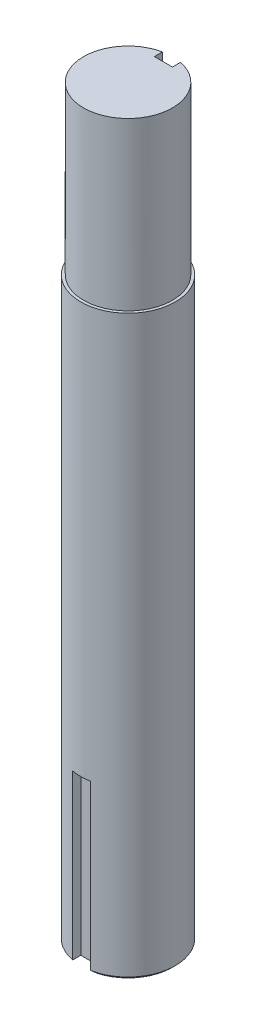
ISO-10303-21;
HEADER;
FILE_DESCRIPTION(('STEP AP214'),'2;1');
FILE_NAME('part.step','',(''),(''),'','','');
FILE_SCHEMA(('AUTOMOTIVE_DESIGN { 1 0 10303 214 1 1 1 1 }'));
ENDSEC;
DATA;
#1=APPLICATION_CONTEXT('core data for automotive mechanical design processes');
#2=APPLICATION_PROTOCOL_DEFINITION('international standard','automotive_design',2000,#1);
#3=PRODUCT_CONTEXT('',#1,'mechanical');
#4=PRODUCT('Part','Part','',(#3));
#5=PRODUCT_RELATED_PRODUCT_CATEGORY('part','',(#4));
#6=PRODUCT_DEFINITION_FORMATION('','',#4);
#7=PRODUCT_DEFINITION_CONTEXT('part definition',#1,'design');
#8=PRODUCT_DEFINITION('design','',#6,#7);
#9=PRODUCT_DEFINITION_SHAPE('','',#8);
#10=(LENGTH_UNIT() NAMED_UNIT(*) SI_UNIT(.MILLI.,.METRE.));
#11=(NAMED_UNIT(*) PLANE_ANGLE_UNIT() SI_UNIT($,.RADIAN.));
#12=(NAMED_UNIT(*) SI_UNIT($,.STERADIAN.) SOLID_ANGLE_UNIT());
#13=UNCERTAINTY_MEASURE_WITH_UNIT(LENGTH_MEASURE(1.E-05),#10,'distance_accuracy_value','');
#14=(GEOMETRIC_REPRESENTATION_CONTEXT(3) GLOBAL_UNCERTAINTY_ASSIGNED_CONTEXT((#13)) GLOBAL_UNIT_ASSIGNED_CONTEXT((#10,
#11,#12)) REPRESENTATION_CONTEXT('',''));
#15=CARTESIAN_POINT('',(0.,0.,0.));
#16=DIRECTION('',(0.,0.,1.));
#17=DIRECTION('',(1.,0.,0.));
#18=AXIS2_PLACEMENT_3D('',#15,#16,#17);
#19=CARTESIAN_POINT('',(0.,134.,0.));
#20=DIRECTION('',(0.,1.,0.));
#21=DIRECTION('',(0.,0.,1.));
#22=AXIS2_PLACEMENT_3D('',#19,#20,#21);
#23=CYLINDRICAL_SURFACE('',#22,8.49999999999999);
#24=DIRECTION('',(0.,1.,0.));
#25=VECTOR('',#24,1.);
#26=CARTESIAN_POINT('',(1.625,134.,8.34322329798261));
#27=LINE('',#26,#25);
#28=CARTESIAN_POINT('',(1.625,30.,8.34322329798261));
#29=VERTEX_POINT('',#28);
#30=CARTESIAN_POINT('',(1.625,0.500000000000028,8.34322329798261));
#31=VERTEX_POINT('',#30);
#32=EDGE_CURVE('E163',#29,#31,#27,.F.);
#33=ORIENTED_EDGE('',*,*,#32,.T.);
#34=CARTESIAN_POINT('',(0.,0.500000000000028,0.));
#35=DIRECTION('',(0.,1.,0.));
#36=DIRECTION('',(0.,0.,1.));
#37=AXIS2_PLACEMENT_3D('',#34,#35,#36);
#38=CIRCLE('',#37,8.49999999999999);
#39=CARTESIAN_POINT('',(-1.625,0.500000000000028,8.34322329798261));
#40=VERTEX_POINT('',#39);
#41=EDGE_CURVE('E169',#31,#40,#38,.T.);
#42=ORIENTED_EDGE('',*,*,#41,.T.);
#43=DIRECTION('',(0.,1.,0.));
#44=VECTOR('',#43,1.);
#45=CARTESIAN_POINT('',(-1.625,134.,8.34322329798261));
#46=LINE('',#45,#44);
#47=CARTESIAN_POINT('',(-1.625,30.,8.34322329798261));
#48=VERTEX_POINT('',#47);
#49=EDGE_CURVE('E160',#40,#48,#46,.T.);
#50=ORIENTED_EDGE('',*,*,#49,.T.);
#51=CARTESIAN_POINT('',(0.,30.,0.));
#52=DIRECTION('',(0.,-1.,0.));
#53=DIRECTION('',(1.,0.,0.));
#54=AXIS2_PLACEMENT_3D('',#51,#52,#53);
#55=CIRCLE('',#54,8.49999999999999);
#56=EDGE_CURVE('E166',#29,#48,#55,.T.);
#57=ORIENTED_EDGE('',*,*,#56,.F.);
#58=EDGE_LOOP('',(#33,#42,#50,#57));
#59=FACE_BOUND('',#58,.T.);
#60=CARTESIAN_POINT('',(0.,104.,0.));
#61=DIRECTION('',(0.,1.,0.));
#62=DIRECTION('',(-1.,0.,0.));
#63=AXIS2_PLACEMENT_3D('',#60,#61,#62);
#64=CIRCLE('',#63,8.49999999999999);
#65=CARTESIAN_POINT('',(-8.49999999999999,104.,0.));
#66=VERTEX_POINT('',#65);
#67=EDGE_CURVE('E145',#66,#66,#64,.T.);
#68=ORIENTED_EDGE('',*,*,#67,.F.);
#69=EDGE_LOOP('',(#68));
#70=FACE_BOUND('',#69,.T.);
#71=ADVANCED_FACE('F34',(#59,#70),#23,.T.);
#72=CARTESIAN_POINT('',(8.5,0.,0.));
#73=DIRECTION('',(0.,1.,0.));
#74=DIRECTION('',(0.,0.,1.));
#75=AXIS2_PLACEMENT_3D('',#72,#73,#74);
#76=PLANE('',#75);
#77=DIRECTION('',(-1.,0.,0.));
#78=VECTOR('',#77,1.);
#79=CARTESIAN_POINT('',(8.5,0.,6.37499999999997));
#80=LINE('',#79,#78);
#81=CARTESIAN_POINT('',(2.12500000000003,0.,6.37499999999997));
#82=VERTEX_POINT('',#81);
#83=CARTESIAN_POINT('',(-2.12500000000003,0.,6.37499999999997));
#84=VERTEX_POINT('',#83);
#85=EDGE_CURVE('E175',#82,#84,#80,.T.);
#86=ORIENTED_EDGE('',*,*,#85,.T.);
#87=DIRECTION('',(0.,0.,1.));
#88=VECTOR('',#87,1.);
#89=CARTESIAN_POINT('',(-2.12500000000002,0.,0.));
#90=LINE('',#89,#88);
#91=CARTESIAN_POINT('',(-2.12500000000002,0.,7.71261142545113));
#92=VERTEX_POINT('',#91);
#93=EDGE_CURVE('E177',#84,#92,#90,.T.);
#94=ORIENTED_EDGE('',*,*,#93,.T.);
#95=CARTESIAN_POINT('',(0.,0.,0.));
#96=DIRECTION('',(0.,1.,0.));
#97=DIRECTION('',(0.,0.,1.));
#98=AXIS2_PLACEMENT_3D('',#95,#96,#97);
#99=CIRCLE('',#98,7.99999999999996);
#100=CARTESIAN_POINT('',(2.12500000000002,0.,7.71261142545113));
#101=VERTEX_POINT('',#100);
#102=EDGE_CURVE('E171',#92,#101,#99,.F.);
#103=ORIENTED_EDGE('',*,*,#102,.T.);
#104=DIRECTION('',(0.,0.,-1.));
#105=VECTOR('',#104,1.);
#106=CARTESIAN_POINT('',(2.12500000000003,0.,0.));
#107=LINE('',#106,#105);
#108=EDGE_CURVE('E173',#101,#82,#107,.T.);
#109=ORIENTED_EDGE('',*,*,#108,.T.);
#110=EDGE_LOOP('',(#86,#94,#103,#109));
#111=FACE_BOUND('',#110,.T.);
#112=ADVANCED_FACE('F237',(#111),#76,.F.);
#113=CARTESIAN_POINT('',(0.,30.,0.));
#114=DIRECTION('',(0.,-1.,0.));
#115=DIRECTION('',(1.,0.,0.));
#116=AXIS2_PLACEMENT_3D('',#113,#114,#115);
#117=PLANE('',#116);
#118=ORIENTED_EDGE('',*,*,#56,.T.);
#119=DIRECTION('',(0.,0.,-1.));
#120=VECTOR('',#119,1.);
#121=CARTESIAN_POINT('',(-1.625,30.,10.125));
#122=LINE('',#121,#120);
#123=CARTESIAN_POINT('',(-1.625,30.,6.875));
#124=VERTEX_POINT('',#123);
#125=EDGE_CURVE('E151',#48,#124,#122,.T.);
#126=ORIENTED_EDGE('',*,*,#125,.T.);
#127=DIRECTION('',(1.,0.,0.));
#128=VECTOR('',#127,1.);
#129=CARTESIAN_POINT('',(-1.625,30.,6.875));
#130=LINE('',#129,#128);
#131=CARTESIAN_POINT('',(1.625,30.,6.875));
#132=VERTEX_POINT('',#131);
#133=EDGE_CURVE('E154',#124,#132,#130,.T.);
#134=ORIENTED_EDGE('',*,*,#133,.T.);
#135=DIRECTION('',(0.,0.,1.));
#136=VECTOR('',#135,1.);
#137=CARTESIAN_POINT('',(1.625,30.,10.125));
#138=LINE('',#137,#136);
#139=EDGE_CURVE('E148',#132,#29,#138,.T.);
#140=ORIENTED_EDGE('',*,*,#139,.T.);
#141=EDGE_LOOP('',(#118,#126,#134,#140));
#142=FACE_BOUND('',#141,.T.);
#143=ADVANCED_FACE('F243',(#142),#117,.T.);
#144=CARTESIAN_POINT('',(1.625,30.,10.125));
#145=DIRECTION('',(1.,0.,0.));
#146=DIRECTION('',(0.,0.,-1.));
#147=AXIS2_PLACEMENT_3D('',#144,#145,#146);
#148=PLANE('',#147);
#149=DIRECTION('',(0.,-1.,0.));
#150=VECTOR('',#149,1.);
#151=CARTESIAN_POINT('',(1.625,30.,6.875));
#152=LINE('',#151,#150);
#153=CARTESIAN_POINT('',(1.625,0.500000000000025,6.875));
#154=VERTEX_POINT('',#153);
#155=EDGE_CURVE('E158',#132,#154,#152,.T.);
#156=ORIENTED_EDGE('',*,*,#155,.T.);
#157=DIRECTION('',(0.,0.,1.));
#158=VECTOR('',#157,1.);
#159=CARTESIAN_POINT('',(1.625,0.500000000000025,10.125));
#160=LINE('',#159,#158);
#161=EDGE_CURVE('E184',#154,#31,#160,.T.);
#162=ORIENTED_EDGE('',*,*,#161,.T.);
#163=ORIENTED_EDGE('',*,*,#32,.F.);
#164=ORIENTED_EDGE('',*,*,#139,.F.);
#165=EDGE_LOOP('',(#156,#162,#163,#164));
#166=FACE_BOUND('',#165,.T.);
#167=ADVANCED_FACE('F248',(#166),#148,.F.);
#168=CARTESIAN_POINT('',(-1.625,30.,10.125));
#169=DIRECTION('',(-1.,0.,0.));
#170=DIRECTION('',(0.,0.,1.));
#171=AXIS2_PLACEMENT_3D('',#168,#169,#170);
#172=PLANE('',#171);
#173=ORIENTED_EDGE('',*,*,#49,.F.);
#174=DIRECTION('',(0.,0.,-1.));
#175=VECTOR('',#174,1.);
#176=CARTESIAN_POINT('',(-1.625,0.500000000000025,10.125));
#177=LINE('',#176,#175);
#178=CARTESIAN_POINT('',(-1.625,0.500000000000025,6.875));
#179=VERTEX_POINT('',#178);
#180=EDGE_CURVE('E180',#40,#179,#177,.T.);
#181=ORIENTED_EDGE('',*,*,#180,.T.);
#182=DIRECTION('',(0.,-1.,0.));
#183=VECTOR('',#182,1.);
#184=CARTESIAN_POINT('',(-1.625,30.,6.875));
#185=LINE('',#184,#183);
#186=EDGE_CURVE('E157',#124,#179,#185,.T.);
#187=ORIENTED_EDGE('',*,*,#186,.F.);
#188=ORIENTED_EDGE('',*,*,#125,.F.);
#189=EDGE_LOOP('',(#173,#181,#187,#188));
#190=FACE_BOUND('',#189,.T.);
#191=ADVANCED_FACE('F251',(#190),#172,.F.);
#192=CARTESIAN_POINT('',(-1.625,30.,6.875));
#193=DIRECTION('',(0.,0.,-1.));
#194=DIRECTION('',(-1.,0.,0.));
#195=AXIS2_PLACEMENT_3D('',#192,#193,#194);
#196=PLANE('',#195);
#197=ORIENTED_EDGE('',*,*,#186,.T.);
#198=DIRECTION('',(1.,0.,0.));
#199=VECTOR('',#198,1.);
#200=CARTESIAN_POINT('',(-1.625,0.500000000000025,6.875));
#201=LINE('',#200,#199);
#202=EDGE_CURVE('E57',#179,#154,#201,.T.);
#203=ORIENTED_EDGE('',*,*,#202,.T.);
#204=ORIENTED_EDGE('',*,*,#155,.F.);
#205=ORIENTED_EDGE('',*,*,#133,.F.);
#206=EDGE_LOOP('',(#197,#203,#204,#205));
#207=FACE_BOUND('',#206,.T.);
#208=ADVANCED_FACE('F206',(#207),#196,.F.);
#209=CARTESIAN_POINT('',(1.625,0.500000000000025,10.125));
#210=DIRECTION('',(0.707106781186547,0.707106781186549,0.));
#211=DIRECTION('',(0.,0.,1.));
#212=AXIS2_PLACEMENT_3D('',#209,#210,#211);
#213=PLANE('',#212);
#214=CARTESIAN_POINT('',(1.625,0.500000000000026,8.34322329798261));
#215=CARTESIAN_POINT('',(1.66737279171778,0.457627208282244,8.29180115909303));
#216=CARTESIAN_POINT('',(1.70957973578112,0.415420264218903,8.24010533651233));
#217=CARTESIAN_POINT('',(1.79364274719649,0.331357252803539,8.13615765110938));
#218=CARTESIAN_POINT('',(1.83549884754812,0.289501152451909,8.08390584165546));
#219=CARTESIAN_POINT('',(1.91884936388387,0.206150636116151,7.97882734535243));
#220=CARTESIAN_POINT('',(1.96034377721472,0.164656222785309,7.92600065429245));
#221=CARTESIAN_POINT('',(2.04295800699789,0.0820419930021379,7.81975362232698));
#222=CARTESIAN_POINT('',(2.08407778743171,0.0409222125683149,7.76633322541406));
#223=CARTESIAN_POINT('',(2.12500000000002,0.,7.71261142545114));
#224=B_SPLINE_CURVE_WITH_KNOTS('',3,(#214,#215,#216,#217,#218,#219,#220,#221,#222,#223),
.UNSPECIFIED.,.F.,.F.,(4,2,2,2,4),(0.,0.23688828637859,0.473754035732428,0.71062152123972,
0.947511544651975),.UNSPECIFIED.);
#225=EDGE_CURVE('E208',#31,#101,#224,.T.);
#226=ORIENTED_EDGE('',*,*,#225,.F.);
#227=ORIENTED_EDGE('',*,*,#161,.F.);
#228=DIRECTION('',(0.577350269189627,-0.577350269189625,-0.577350269189626));
#229=VECTOR('',#228,1.);
#230=CARTESIAN_POINT('',(0.541666666666665,1.58333333333336,7.95833333333333));
#231=LINE('',#230,#229);
#232=EDGE_CURVE('E152',#82,#154,#231,.F.);
#233=ORIENTED_EDGE('',*,*,#232,.F.);
#234=ORIENTED_EDGE('',*,*,#108,.F.);
#235=EDGE_LOOP('',(#226,#227,#233,#234));
#236=FACE_BOUND('',#235,.T.);
#237=ADVANCED_FACE('F203',(#236),#213,.F.);
#238=CARTESIAN_POINT('',(-1.625,0.500000000000025,6.875));
#239=DIRECTION('',(0.,0.707106781186548,-0.707106781186547));
#240=DIRECTION('',(1.,0.,0.));
#241=AXIS2_PLACEMENT_3D('',#238,#239,#240);
#242=PLANE('',#241);
#243=ORIENTED_EDGE('',*,*,#232,.T.);
#244=ORIENTED_EDGE('',*,*,#202,.F.);
#245=DIRECTION('',(-0.577350269189626,-0.577350269189625,-0.577350269189626));
#246=VECTOR('',#245,1.);
#247=CARTESIAN_POINT('',(-4.25000000000002,-2.12499999999999,4.24999999999998));
#248=LINE('',#247,#246);
#249=EDGE_CURVE('E193',#84,#179,#248,.F.);
#250=ORIENTED_EDGE('',*,*,#249,.F.);
#251=ORIENTED_EDGE('',*,*,#85,.F.);
#252=EDGE_LOOP('',(#243,#244,#250,#251));
#253=FACE_BOUND('',#252,.T.);
#254=ADVANCED_FACE('F36',(#253),#242,.F.);
#255=CARTESIAN_POINT('',(0.,0.500000000000028,0.));
#256=DIRECTION('',(0.,1.,0.));
#257=DIRECTION('',(0.,0.,1.));
#258=AXIS2_PLACEMENT_3D('',#255,#256,#257);
#259=CONICAL_SURFACE('',#258,8.49999999999999,0.785398163397448);
#260=ORIENTED_EDGE('',*,*,#225,.T.);
#261=ORIENTED_EDGE('',*,*,#102,.F.);
#262=CARTESIAN_POINT('',(-2.12500000000003,0.,7.71261142545116));
#263=CARTESIAN_POINT('',(-2.08407778743171,0.0409222125683114,7.76633322541406));
#264=CARTESIAN_POINT('',(-2.04295800699789,0.0820419930021365,7.81975362232698));
#265=CARTESIAN_POINT('',(-1.96034377721472,0.164656222785309,7.92600065429245));
#266=CARTESIAN_POINT('',(-1.91884936388387,0.206150636116151,7.97882734535242));
#267=CARTESIAN_POINT('',(-1.83549884754812,0.289501152451908,8.08390584165546));
#268=CARTESIAN_POINT('',(-1.79364274719649,0.331357252803538,8.13615765110938));
#269=CARTESIAN_POINT('',(-1.70957973578112,0.415420264218901,8.24010533651234));
#270=CARTESIAN_POINT('',(-1.66737279171778,0.45762720828224,8.29180115909303));
#271=CARTESIAN_POINT('',(-1.62500000000001,0.500000000000018,8.34322329798262));
#272=B_SPLINE_CURVE_WITH_KNOTS('',3,(#262,#263,#264,#265,#266,#267,#268,#269,#270,#271),
.UNSPECIFIED.,.F.,.F.,(4,2,2,2,4),(0.,0.236890023412253,0.473757508919543,0.710623258273383,
0.94751154465197),.UNSPECIFIED.);
#273=EDGE_CURVE('E186',#40,#92,#272,.F.);
#274=ORIENTED_EDGE('',*,*,#273,.F.);
#275=ORIENTED_EDGE('',*,*,#41,.F.);
#276=EDGE_LOOP('',(#260,#261,#274,#275));
#277=FACE_BOUND('',#276,.T.);
#278=ADVANCED_FACE('F195',(#277),#259,.T.);
#279=CARTESIAN_POINT('',(-2.12500000000002,0.,0.));
#280=DIRECTION('',(-0.707106781186547,0.707106781186548,0.));
#281=DIRECTION('',(0.,0.,1.));
#282=AXIS2_PLACEMENT_3D('',#279,#280,#281);
#283=PLANE('',#282);
#284=ORIENTED_EDGE('',*,*,#249,.T.);
#285=ORIENTED_EDGE('',*,*,#180,.F.);
#286=ORIENTED_EDGE('',*,*,#273,.T.);
#287=ORIENTED_EDGE('',*,*,#93,.F.);
#288=EDGE_LOOP('',(#284,#285,#286,#287));
#289=FACE_BOUND('',#288,.T.);
#290=ADVANCED_FACE('F198',(#289),#283,.F.);
#291=CARTESIAN_POINT('',(0.,104.,0.));
#292=DIRECTION('',(0.,1.,0.));
#293=DIRECTION('',(-1.,0.,0.));
#294=AXIS2_PLACEMENT_3D('',#291,#292,#293);
#295=PLANE('',#294);
#296=CARTESIAN_POINT('',(0.,104.,0.));
#297=DIRECTION('',(0.,1.,0.));
#298=DIRECTION('',(-1.,0.,0.));
#299=AXIS2_PLACEMENT_3D('',#296,#297,#298);
#300=CIRCLE('',#299,8.);
#301=CARTESIAN_POINT('',(-8.,104.,0.));
#302=VERTEX_POINT('',#301);
#303=EDGE_CURVE('E142',#302,#302,#300,.T.);
#304=ORIENTED_EDGE('',*,*,#303,.F.);
#305=EDGE_LOOP('',(#304));
#306=FACE_BOUND('',#305,.T.);
#307=ORIENTED_EDGE('',*,*,#67,.T.);
#308=EDGE_LOOP('',(#307));
#309=FACE_BOUND('',#308,.T.);
#310=ADVANCED_FACE('F201',(#306,#309),#295,.T.);
#311=CARTESIAN_POINT('',(0.,104.,0.));
#312=DIRECTION('',(0.,1.,0.));
#313=DIRECTION('',(-1.,0.,0.));
#314=AXIS2_PLACEMENT_3D('',#311,#312,#313);
#315=CYLINDRICAL_SURFACE('',#314,8.);
#316=DIRECTION('',(0.,1.,0.));
#317=VECTOR('',#316,1.);
#318=CARTESIAN_POINT('',(1.625,104.,-7.83322251694665));
#319=LINE('',#318,#317);
#320=CARTESIAN_POINT('',(1.625,134.,-7.83322251694665));
#321=VERTEX_POINT('',#320);
#322=CARTESIAN_POINT('',(1.625,109.,-7.83322251694665));
#323=VERTEX_POINT('',#322);
#324=EDGE_CURVE('E139',#321,#323,#319,.F.);
#325=ORIENTED_EDGE('',*,*,#324,.F.);
#326=CARTESIAN_POINT('',(0.,134.,0.));
#327=DIRECTION('',(0.,1.,0.));
#328=DIRECTION('',(-1.,0.,0.));
#329=AXIS2_PLACEMENT_3D('',#326,#327,#328);
#330=CIRCLE('',#329,8.);
#331=CARTESIAN_POINT('',(-1.625,134.,-7.83322251694665));
#332=VERTEX_POINT('',#331);
#333=EDGE_CURVE('E141',#332,#321,#330,.T.);
#334=ORIENTED_EDGE('',*,*,#333,.F.);
#335=DIRECTION('',(0.,1.,0.));
#336=VECTOR('',#335,1.);
#337=CARTESIAN_POINT('',(-1.625,104.,-7.83322251694665));
#338=LINE('',#337,#336);
#339=CARTESIAN_POINT('',(-1.625,109.,-7.83322251694665));
#340=VERTEX_POINT('',#339);
#341=EDGE_CURVE('E49',#340,#332,#338,.T.);
#342=ORIENTED_EDGE('',*,*,#341,.F.);
#343=CARTESIAN_POINT('',(0.,109.,0.));
#344=DIRECTION('',(0.,1.,0.));
#345=DIRECTION('',(0.,0.,1.));
#346=AXIS2_PLACEMENT_3D('',#343,#344,#345);
#347=CIRCLE('',#346,8.);
#348=EDGE_CURVE('E12',#340,#323,#347,.F.);
#349=ORIENTED_EDGE('',*,*,#348,.T.);
#350=EDGE_LOOP('',(#325,#334,#342,#349));
#351=FACE_BOUND('',#350,.T.);
#352=ORIENTED_EDGE('',*,*,#303,.T.);
#353=EDGE_LOOP('',(#352));
#354=FACE_BOUND('',#353,.T.);
#355=ADVANCED_FACE('F223',(#351,#354),#315,.T.);
#356=CARTESIAN_POINT('',(8.49999999999999,134.,0.));
#357=DIRECTION('',(0.,-1.,0.));
#358=DIRECTION('',(0.,0.,-1.));
#359=AXIS2_PLACEMENT_3D('',#356,#357,#358);
#360=PLANE('',#359);
#361=ORIENTED_EDGE('',*,*,#333,.T.);
#362=DIRECTION('',(0.,0.,-1.));
#363=VECTOR('',#362,1.);
#364=CARTESIAN_POINT('',(1.625,134.,-9.625));
#365=LINE('',#364,#363);
#366=CARTESIAN_POINT('',(1.625,134.,-6.375));
#367=VERTEX_POINT('',#366);
#368=EDGE_CURVE('E133',#367,#321,#365,.T.);
#369=ORIENTED_EDGE('',*,*,#368,.F.);
#370=DIRECTION('',(1.,0.,0.));
#371=VECTOR('',#370,1.);
#372=CARTESIAN_POINT('',(-1.625,134.,-6.375));
#373=LINE('',#372,#371);
#374=CARTESIAN_POINT('',(-1.625,134.,-6.375));
#375=VERTEX_POINT('',#374);
#376=EDGE_CURVE('E135',#375,#367,#373,.T.);
#377=ORIENTED_EDGE('',*,*,#376,.F.);
#378=DIRECTION('',(0.,0.,-1.));
#379=VECTOR('',#378,1.);
#380=CARTESIAN_POINT('',(-1.625,134.,0.));
#381=LINE('',#380,#379);
#382=EDGE_CURVE('E42',#375,#332,#381,.T.);
#383=ORIENTED_EDGE('',*,*,#382,.T.);
#384=EDGE_LOOP('',(#361,#369,#377,#383));
#385=FACE_BOUND('',#384,.T.);
#386=ADVANCED_FACE('F219',(#385),#360,.F.);
#387=CARTESIAN_POINT('',(1.625,109.,-9.625));
#388=DIRECTION('',(1.,0.,0.));
#389=DIRECTION('',(0.,0.,-1.));
#390=AXIS2_PLACEMENT_3D('',#387,#388,#389);
#391=PLANE('',#390);
#392=ORIENTED_EDGE('',*,*,#324,.T.);
#393=DIRECTION('',(0.,0.,-1.));
#394=VECTOR('',#393,1.);
#395=CARTESIAN_POINT('',(1.625,109.,-9.625));
#396=LINE('',#395,#394);
#397=CARTESIAN_POINT('',(1.625,109.,-6.375));
#398=VERTEX_POINT('',#397);
#399=EDGE_CURVE('E118',#398,#323,#396,.T.);
#400=ORIENTED_EDGE('',*,*,#399,.F.);
#401=DIRECTION('',(0.,1.,0.));
#402=VECTOR('',#401,1.);
#403=CARTESIAN_POINT('',(1.625,109.,-6.375));
#404=LINE('',#403,#402);
#405=EDGE_CURVE('E126',#398,#367,#404,.T.);
#406=ORIENTED_EDGE('',*,*,#405,.T.);
#407=ORIENTED_EDGE('',*,*,#368,.T.);
#408=EDGE_LOOP('',(#392,#400,#406,#407));
#409=FACE_BOUND('',#408,.T.);
#410=ADVANCED_FACE('F226',(#409),#391,.F.);
#411=CARTESIAN_POINT('',(-1.625,109.,-6.375));
#412=DIRECTION('',(0.,0.,1.));
#413=DIRECTION('',(1.,0.,0.));
#414=AXIS2_PLACEMENT_3D('',#411,#412,#413);
#415=PLANE('',#414);
#416=ORIENTED_EDGE('',*,*,#376,.T.);
#417=ORIENTED_EDGE('',*,*,#405,.F.);
#418=DIRECTION('',(1.,0.,0.));
#419=VECTOR('',#418,1.);
#420=CARTESIAN_POINT('',(-1.625,109.,-6.375));
#421=LINE('',#420,#419);
#422=CARTESIAN_POINT('',(-1.625,109.,-6.375));
#423=VERTEX_POINT('',#422);
#424=EDGE_CURVE('E117',#423,#398,#421,.T.);
#425=ORIENTED_EDGE('',*,*,#424,.F.);
#426=DIRECTION('',(0.,1.,0.));
#427=VECTOR('',#426,1.);
#428=CARTESIAN_POINT('',(-1.625,109.,-6.375));
#429=LINE('',#428,#427);
#430=EDGE_CURVE('E121',#423,#375,#429,.T.);
#431=ORIENTED_EDGE('',*,*,#430,.T.);
#432=EDGE_LOOP('',(#416,#417,#425,#431));
#433=FACE_BOUND('',#432,.T.);
#434=ADVANCED_FACE('F128',(#433),#415,.F.);
#435=CARTESIAN_POINT('',(-1.625,109.,-9.625));
#436=DIRECTION('',(-1.,0.,0.));
#437=DIRECTION('',(0.,0.,1.));
#438=AXIS2_PLACEMENT_3D('',#435,#436,#437);
#439=PLANE('',#438);
#440=ORIENTED_EDGE('',*,*,#341,.T.);
#441=ORIENTED_EDGE('',*,*,#382,.F.);
#442=ORIENTED_EDGE('',*,*,#430,.F.);
#443=DIRECTION('',(0.,0.,1.));
#444=VECTOR('',#443,1.);
#445=CARTESIAN_POINT('',(-1.625,109.,-9.625));
#446=LINE('',#445,#444);
#447=EDGE_CURVE('E112',#340,#423,#446,.T.);
#448=ORIENTED_EDGE('',*,*,#447,.F.);
#449=EDGE_LOOP('',(#440,#441,#442,#448));
#450=FACE_BOUND('',#449,.T.);
#451=ADVANCED_FACE('F122',(#450),#439,.F.);
#452=CARTESIAN_POINT('',(0.,109.,0.));
#453=DIRECTION('',(0.,1.,0.));
#454=DIRECTION('',(0.,0.,1.));
#455=AXIS2_PLACEMENT_3D('',#452,#453,#454);
#456=PLANE('',#455);
#457=ORIENTED_EDGE('',*,*,#447,.T.);
#458=ORIENTED_EDGE('',*,*,#424,.T.);
#459=ORIENTED_EDGE('',*,*,#399,.T.);
#460=ORIENTED_EDGE('',*,*,#348,.F.);
#461=EDGE_LOOP('',(#457,#458,#459,#460));
#462=FACE_BOUND('',#461,.T.);
#463=ADVANCED_FACE('F114',(#462),#456,.T.);
#464=CLOSED_SHELL('',(#71,#112,#143,#167,#191,#208,#237,#254,#278,#290,#310,#355,#386,#410,#434,
#451,#463));
#465=MANIFOLD_SOLID_BREP('B2',#464);
#466=ADVANCED_BREP_SHAPE_REPRESENTATION('',(#18,#465),#14);
#467=SHAPE_DEFINITION_REPRESENTATION(#9,#466);
ENDSEC;
END-ISO-10303-21;
